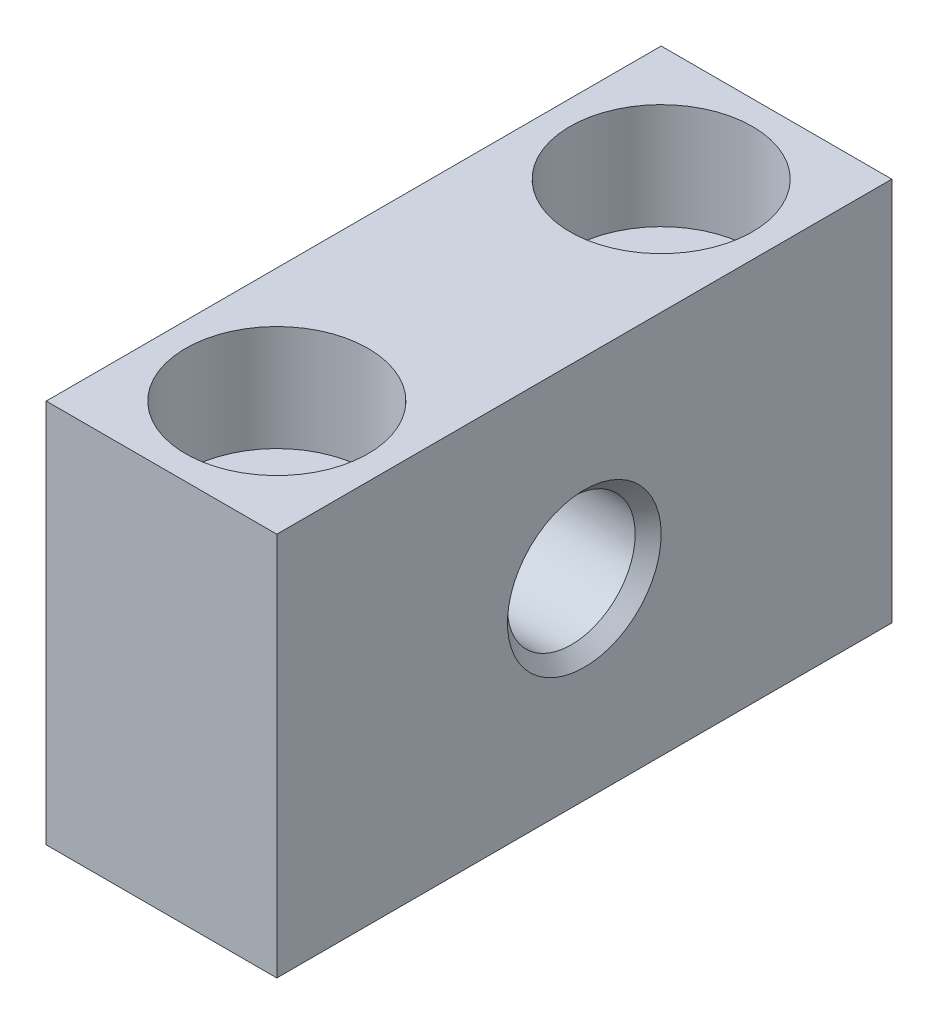
ISO-10303-21;
HEADER;
FILE_DESCRIPTION(('STEP AP214'),'2;1');
FILE_NAME('part.step','',(''),(''),'','','');
FILE_SCHEMA(('AUTOMOTIVE_DESIGN { 1 0 10303 214 1 1 1 1 }'));
ENDSEC;
DATA;
#1=APPLICATION_CONTEXT('core data for automotive mechanical design processes');
#2=APPLICATION_PROTOCOL_DEFINITION('international standard','automotive_design',2000,#1);
#3=PRODUCT_CONTEXT('',#1,'mechanical');
#4=PRODUCT('Part','Part','',(#3));
#5=PRODUCT_RELATED_PRODUCT_CATEGORY('part','',(#4));
#6=PRODUCT_DEFINITION_FORMATION('','',#4);
#7=PRODUCT_DEFINITION_CONTEXT('part definition',#1,'design');
#8=PRODUCT_DEFINITION('design','',#6,#7);
#9=PRODUCT_DEFINITION_SHAPE('','',#8);
#10=(LENGTH_UNIT() NAMED_UNIT(*) SI_UNIT(.MILLI.,.METRE.));
#11=(NAMED_UNIT(*) PLANE_ANGLE_UNIT() SI_UNIT($,.RADIAN.));
#12=(NAMED_UNIT(*) SI_UNIT($,.STERADIAN.) SOLID_ANGLE_UNIT());
#13=UNCERTAINTY_MEASURE_WITH_UNIT(LENGTH_MEASURE(1.E-05),#10,'distance_accuracy_value','');
#14=(GEOMETRIC_REPRESENTATION_CONTEXT(3) GLOBAL_UNCERTAINTY_ASSIGNED_CONTEXT((#13)) GLOBAL_UNIT_ASSIGNED_CONTEXT((#10,
#11,#12)) REPRESENTATION_CONTEXT('',''));
#15=CARTESIAN_POINT('',(0.,0.,0.));
#16=DIRECTION('',(0.,0.,1.));
#17=DIRECTION('',(1.,0.,0.));
#18=AXIS2_PLACEMENT_3D('',#15,#16,#17);
#19=CARTESIAN_POINT('',(6.,14.4999999999982,-10.));
#20=DIRECTION('',(0.,1.,0.));
#21=DIRECTION('',(-1.,0.,0.));
#22=AXIS2_PLACEMENT_3D('',#19,#20,#21);
#23=CONICAL_SURFACE('',#22,2.50000000012051,0.785398163397448);
#24=CARTESIAN_POINT('',(6.,14.4999999999413,-10.));
#25=DIRECTION('',(0.,1.,0.));
#26=DIRECTION('',(-1.,0.,0.));
#27=AXIS2_PLACEMENT_3D('',#24,#25,#26);
#28=CIRCLE('',#27,2.50000000006366);
#29=CARTESIAN_POINT('',(3.49999999993634,14.4999999999413,-10.));
#30=VERTEX_POINT('',#29);
#31=EDGE_CURVE('E106',#30,#30,#28,.F.);
#32=ORIENTED_EDGE('',*,*,#31,.F.);
#33=EDGE_LOOP('',(#32));
#34=FACE_BOUND('',#33,.T.);
#35=CARTESIAN_POINT('',(6.,14.067,-10.));
#36=DIRECTION('',(0.,1.,0.));
#37=DIRECTION('',(0.,0.,1.));
#38=AXIS2_PLACEMENT_3D('',#35,#36,#37);
#39=CIRCLE('',#38,2.067);
#40=CARTESIAN_POINT('',(6.,14.067,-7.933));
#41=VERTEX_POINT('',#40);
#42=EDGE_CURVE('E104',#41,#41,#39,.F.);
#43=ORIENTED_EDGE('',*,*,#42,.T.);
#44=EDGE_LOOP('',(#43));
#45=FACE_BOUND('',#44,.T.);
#46=ADVANCED_FACE('F17',(#34,#45),#23,.F.);
#47=CARTESIAN_POINT('',(6.,14.4999999999982,10.));
#48=DIRECTION('',(0.,1.,0.));
#49=DIRECTION('',(-1.,0.,0.));
#50=AXIS2_PLACEMENT_3D('',#47,#48,#49);
#51=CONICAL_SURFACE('',#50,2.50000000015916,0.785398163397448);
#52=CARTESIAN_POINT('',(6.,14.067,10.));
#53=DIRECTION('',(0.,1.,0.));
#54=DIRECTION('',(0.,0.,1.));
#55=AXIS2_PLACEMENT_3D('',#52,#53,#54);
#56=CIRCLE('',#55,2.067);
#57=CARTESIAN_POINT('',(6.,14.067,12.067));
#58=VERTEX_POINT('',#57);
#59=EDGE_CURVE('E100',#58,#58,#56,.F.);
#60=ORIENTED_EDGE('',*,*,#59,.T.);
#61=EDGE_LOOP('',(#60));
#62=FACE_BOUND('',#61,.T.);
#63=CARTESIAN_POINT('',(6.,14.4999999999413,10.));
#64=DIRECTION('',(0.,1.,0.));
#65=DIRECTION('',(-1.,0.,0.));
#66=AXIS2_PLACEMENT_3D('',#63,#64,#65);
#67=CIRCLE('',#66,2.50000000010232);
#68=CARTESIAN_POINT('',(3.49999999989768,14.4999999999413,10.));
#69=VERTEX_POINT('',#68);
#70=EDGE_CURVE('E20',#69,#69,#67,.F.);
#71=ORIENTED_EDGE('',*,*,#70,.F.);
#72=EDGE_LOOP('',(#71));
#73=FACE_BOUND('',#72,.T.);
#74=ADVANCED_FACE('F132',(#62,#73),#51,.F.);
#75=CARTESIAN_POINT('',(6.,14.5,10.));
#76=DIRECTION('',(0.,1.,0.));
#77=DIRECTION('',(0.,0.,1.));
#78=AXIS2_PLACEMENT_3D('',#75,#76,#77);
#79=PLANE('',#78);
#80=ORIENTED_EDGE('',*,*,#70,.T.);
#81=EDGE_LOOP('',(#80));
#82=FACE_BOUND('',#81,.T.);
#83=CARTESIAN_POINT('',(6.,14.5,10.));
#84=DIRECTION('',(0.,-1.,0.));
#85=DIRECTION('',(0.,0.,-1.));
#86=AXIS2_PLACEMENT_3D('',#83,#84,#85);
#87=CIRCLE('',#86,4.75);
#88=CARTESIAN_POINT('',(6.,14.5,5.25));
#89=VERTEX_POINT('',#88);
#90=EDGE_CURVE('E103',#89,#89,#87,.F.);
#91=ORIENTED_EDGE('',*,*,#90,.T.);
#92=EDGE_LOOP('',(#91));
#93=FACE_BOUND('',#92,.T.);
#94=ADVANCED_FACE('F129',(#82,#93),#79,.T.);
#95=CARTESIAN_POINT('',(6.,14.5,-10.));
#96=DIRECTION('',(0.,1.,0.));
#97=DIRECTION('',(0.,0.,1.));
#98=AXIS2_PLACEMENT_3D('',#95,#96,#97);
#99=PLANE('',#98);
#100=ORIENTED_EDGE('',*,*,#31,.T.);
#101=EDGE_LOOP('',(#100));
#102=FACE_BOUND('',#101,.T.);
#103=CARTESIAN_POINT('',(6.,14.5,-10.));
#104=DIRECTION('',(0.,-1.,0.));
#105=DIRECTION('',(0.,0.,-1.));
#106=AXIS2_PLACEMENT_3D('',#103,#104,#105);
#107=CIRCLE('',#106,4.75);
#108=CARTESIAN_POINT('',(6.,14.5,-14.75));
#109=VERTEX_POINT('',#108);
#110=EDGE_CURVE('E99',#109,#109,#107,.F.);
#111=ORIENTED_EDGE('',*,*,#110,.T.);
#112=EDGE_LOOP('',(#111));
#113=FACE_BOUND('',#112,.T.);
#114=ADVANCED_FACE('F140',(#102,#113),#99,.T.);
#115=CARTESIAN_POINT('',(6.,0.,-10.));
#116=DIRECTION('',(0.,1.,0.));
#117=DIRECTION('',(0.,0.,1.));
#118=AXIS2_PLACEMENT_3D('',#115,#116,#117);
#119=CYLINDRICAL_SURFACE('',#118,2.067);
#120=ORIENTED_EDGE('',*,*,#42,.F.);
#121=EDGE_LOOP('',(#120));
#122=FACE_BOUND('',#121,.T.);
#123=CARTESIAN_POINT('',(6.,0.433000000043648,-10.));
#124=DIRECTION('',(0.,-1.,0.));
#125=DIRECTION('',(0.,0.,-1.));
#126=AXIS2_PLACEMENT_3D('',#123,#124,#125);
#127=CIRCLE('',#126,2.06700000000183);
#128=CARTESIAN_POINT('',(6.,0.433000000043648,-12.0670000000018));
#129=VERTEX_POINT('',#128);
#130=EDGE_CURVE('E96',#129,#129,#127,.T.);
#131=ORIENTED_EDGE('',*,*,#130,.T.);
#132=EDGE_LOOP('',(#131));
#133=FACE_BOUND('',#132,.T.);
#134=ADVANCED_FACE('F198',(#122,#133),#119,.F.);
#135=CARTESIAN_POINT('',(6.,0.,10.));
#136=DIRECTION('',(0.,1.,0.));
#137=DIRECTION('',(0.,0.,1.));
#138=AXIS2_PLACEMENT_3D('',#135,#136,#137);
#139=CYLINDRICAL_SURFACE('',#138,2.067);
#140=ORIENTED_EDGE('',*,*,#59,.F.);
#141=EDGE_LOOP('',(#140));
#142=FACE_BOUND('',#141,.T.);
#143=CARTESIAN_POINT('',(6.,0.432999999986805,10.));
#144=DIRECTION('',(0.,-1.,0.));
#145=DIRECTION('',(0.,0.,-1.));
#146=AXIS2_PLACEMENT_3D('',#143,#144,#145);
#147=CIRCLE('',#146,2.06700000002002);
#148=CARTESIAN_POINT('',(6.,0.432999999986805,7.93299999997998));
#149=VERTEX_POINT('',#148);
#150=EDGE_CURVE('E93',#149,#149,#147,.T.);
#151=ORIENTED_EDGE('',*,*,#150,.T.);
#152=EDGE_LOOP('',(#151));
#153=FACE_BOUND('',#152,.T.);
#154=ADVANCED_FACE('F194',(#142,#153),#139,.F.);
#155=CARTESIAN_POINT('',(12.0000000000573,10.,0.));
#156=DIRECTION('',(1.,0.,0.));
#157=DIRECTION('',(0.,0.,-1.));
#158=AXIS2_PLACEMENT_3D('',#155,#156,#157);
#159=CONICAL_SURFACE('',#158,3.99999999996226,0.785398163397448);
#160=CARTESIAN_POINT('',(12.0000000000573,10.,0.));
#161=DIRECTION('',(1.,0.,0.));
#162=DIRECTION('',(0.,0.,-1.));
#163=AXIS2_PLACEMENT_3D('',#160,#161,#162);
#164=CIRCLE('',#163,3.99999999996226);
#165=CARTESIAN_POINT('',(12.0000000000573,10.,-3.99999999996226));
#166=VERTEX_POINT('',#165);
#167=EDGE_CURVE('E92',#166,#166,#164,.T.);
#168=ORIENTED_EDGE('',*,*,#167,.T.);
#169=EDGE_LOOP('',(#168));
#170=FACE_BOUND('',#169,.T.);
#171=CARTESIAN_POINT('',(11.3235,10.,0.));
#172=DIRECTION('',(-1.,0.,0.));
#173=DIRECTION('',(0.,0.,1.));
#174=AXIS2_PLACEMENT_3D('',#171,#172,#173);
#175=CIRCLE('',#174,3.3235);
#176=CARTESIAN_POINT('',(11.3235,10.,3.3235));
#177=VERTEX_POINT('',#176);
#178=EDGE_CURVE('E76',#177,#177,#175,.T.);
#179=ORIENTED_EDGE('',*,*,#178,.T.);
#180=EDGE_LOOP('',(#179));
#181=FACE_BOUND('',#180,.T.);
#182=ADVANCED_FACE('F190',(#170,#181),#159,.F.);
#183=CARTESIAN_POINT('',(6.,14.5,10.));
#184=DIRECTION('',(0.,-1.,0.));
#185=DIRECTION('',(0.,0.,-1.));
#186=AXIS2_PLACEMENT_3D('',#183,#184,#185);
#187=CYLINDRICAL_SURFACE('',#186,4.75);
#188=ORIENTED_EDGE('',*,*,#90,.F.);
#189=EDGE_LOOP('',(#188));
#190=FACE_BOUND('',#189,.T.);
#191=CARTESIAN_POINT('',(6.,20.,10.));
#192=DIRECTION('',(0.,-1.,0.));
#193=DIRECTION('',(0.,0.,-1.));
#194=AXIS2_PLACEMENT_3D('',#191,#192,#193);
#195=CIRCLE('',#194,4.75);
#196=CARTESIAN_POINT('',(6.,20.,5.25));
#197=VERTEX_POINT('',#196);
#198=EDGE_CURVE('E75',#197,#197,#195,.F.);
#199=ORIENTED_EDGE('',*,*,#198,.T.);
#200=EDGE_LOOP('',(#199));
#201=FACE_BOUND('',#200,.T.);
#202=ADVANCED_FACE('F186',(#190,#201),#187,.F.);
#203=CARTESIAN_POINT('',(6.,14.5,-10.));
#204=DIRECTION('',(0.,-1.,0.));
#205=DIRECTION('',(0.,0.,-1.));
#206=AXIS2_PLACEMENT_3D('',#203,#204,#205);
#207=CYLINDRICAL_SURFACE('',#206,4.75);
#208=ORIENTED_EDGE('',*,*,#110,.F.);
#209=EDGE_LOOP('',(#208));
#210=FACE_BOUND('',#209,.T.);
#211=CARTESIAN_POINT('',(6.,20.,-10.));
#212=DIRECTION('',(0.,-1.,0.));
#213=DIRECTION('',(0.,0.,-1.));
#214=AXIS2_PLACEMENT_3D('',#211,#212,#213);
#215=CIRCLE('',#214,4.75);
#216=CARTESIAN_POINT('',(6.,20.,-14.75));
#217=VERTEX_POINT('',#216);
#218=EDGE_CURVE('E66',#217,#217,#215,.F.);
#219=ORIENTED_EDGE('',*,*,#218,.T.);
#220=EDGE_LOOP('',(#219));
#221=FACE_BOUND('',#220,.T.);
#222=ADVANCED_FACE('F182',(#210,#221),#207,.F.);
#223=CARTESIAN_POINT('',(6.,0.,-10.));
#224=DIRECTION('',(0.,-1.,0.));
#225=DIRECTION('',(0.,0.,-1.));
#226=AXIS2_PLACEMENT_3D('',#223,#224,#225);
#227=CONICAL_SURFACE('',#226,2.50000000004547,0.785398163397448);
#228=ORIENTED_EDGE('',*,*,#130,.F.);
#229=EDGE_LOOP('',(#228));
#230=FACE_BOUND('',#229,.T.);
#231=CARTESIAN_POINT('',(6.,0.,-10.));
#232=DIRECTION('',(0.,-1.,0.));
#233=DIRECTION('',(0.,0.,-1.));
#234=AXIS2_PLACEMENT_3D('',#231,#232,#233);
#235=CIRCLE('',#234,2.50000000004547);
#236=CARTESIAN_POINT('',(6.,0.,-12.5000000000455));
#237=VERTEX_POINT('',#236);
#238=EDGE_CURVE('E111',#237,#237,#235,.T.);
#239=ORIENTED_EDGE('',*,*,#238,.T.);
#240=EDGE_LOOP('',(#239));
#241=FACE_BOUND('',#240,.T.);
#242=ADVANCED_FACE('F178',(#230,#241),#227,.F.);
#243=CARTESIAN_POINT('',(6.,5.6843418860808E-11,10.));
#244=DIRECTION('',(0.,-1.,0.));
#245=DIRECTION('',(0.,0.,-1.));
#246=AXIS2_PLACEMENT_3D('',#243,#244,#245);
#247=CONICAL_SURFACE('',#246,2.50000000000682,0.785398163463087);
#248=CARTESIAN_POINT('',(6.,6.59385740441604E-11,10.));
#249=DIRECTION('',(0.,-1.,0.));
#250=DIRECTION('',(0.,0.,-1.));
#251=AXIS2_PLACEMENT_3D('',#248,#249,#250);
#252=CIRCLE('',#251,2.49999999999773);
#253=CARTESIAN_POINT('',(6.,6.59385740441604E-11,7.50000000000227));
#254=VERTEX_POINT('',#253);
#255=EDGE_CURVE('E108',#254,#254,#252,.T.);
#256=ORIENTED_EDGE('',*,*,#255,.T.);
#257=EDGE_LOOP('',(#256));
#258=FACE_BOUND('',#257,.T.);
#259=ORIENTED_EDGE('',*,*,#150,.F.);
#260=EDGE_LOOP('',(#259));
#261=FACE_BOUND('',#260,.T.);
#262=ADVANCED_FACE('F174',(#258,#261),#247,.F.);
#263=CARTESIAN_POINT('',(12.,0.,16.));
#264=DIRECTION('',(-1.,0.,0.));
#265=DIRECTION('',(0.,0.,1.));
#266=AXIS2_PLACEMENT_3D('',#263,#264,#265);
#267=PLANE('',#266);
#268=ORIENTED_EDGE('',*,*,#167,.F.);
#269=EDGE_LOOP('',(#268));
#270=FACE_BOUND('',#269,.T.);
#271=DIRECTION('',(0.,0.,-1.));
#272=VECTOR('',#271,1.);
#273=CARTESIAN_POINT('',(12.,20.,16.));
#274=LINE('',#273,#272);
#275=CARTESIAN_POINT('',(12.,20.,-16.));
#276=VERTEX_POINT('',#275);
#277=CARTESIAN_POINT('',(12.,20.,16.));
#278=VERTEX_POINT('',#277);
#279=EDGE_CURVE('E69',#276,#278,#274,.F.);
#280=ORIENTED_EDGE('',*,*,#279,.T.);
#281=DIRECTION('',(0.,1.,0.));
#282=VECTOR('',#281,1.);
#283=CARTESIAN_POINT('',(12.,0.,16.));
#284=LINE('',#283,#282);
#285=CARTESIAN_POINT('',(12.,0.,16.));
#286=VERTEX_POINT('',#285);
#287=EDGE_CURVE('E56',#286,#278,#284,.T.);
#288=ORIENTED_EDGE('',*,*,#287,.F.);
#289=DIRECTION('',(0.,0.,1.));
#290=VECTOR('',#289,1.);
#291=CARTESIAN_POINT('',(12.,0.,16.));
#292=LINE('',#291,#290);
#293=CARTESIAN_POINT('',(12.,0.,-16.));
#294=VERTEX_POINT('',#293);
#295=EDGE_CURVE('E82',#286,#294,#292,.F.);
#296=ORIENTED_EDGE('',*,*,#295,.T.);
#297=DIRECTION('',(0.,1.,0.));
#298=VECTOR('',#297,1.);
#299=CARTESIAN_POINT('',(12.,0.,-16.));
#300=LINE('',#299,#298);
#301=EDGE_CURVE('E71',#294,#276,#300,.T.);
#302=ORIENTED_EDGE('',*,*,#301,.T.);
#303=EDGE_LOOP('',(#280,#288,#296,#302));
#304=FACE_BOUND('',#303,.T.);
#305=ADVANCED_FACE('F70',(#270,#304),#267,.F.);
#306=CARTESIAN_POINT('',(12.,10.,0.));
#307=DIRECTION('',(-1.,0.,0.));
#308=DIRECTION('',(0.,0.,1.));
#309=AXIS2_PLACEMENT_3D('',#306,#307,#308);
#310=CYLINDRICAL_SURFACE('',#309,3.3235);
#311=CARTESIAN_POINT('',(0.676499999940461,10.,0.));
#312=DIRECTION('',(-1.,0.,0.));
#313=DIRECTION('',(0.,0.,1.));
#314=AXIS2_PLACEMENT_3D('',#311,#312,#313);
#315=CIRCLE('',#314,3.3235000000218);
#316=CARTESIAN_POINT('',(0.676499999940461,10.,3.3235000000218));
#317=VERTEX_POINT('',#316);
#318=EDGE_CURVE('E86',#317,#317,#315,.T.);
#319=ORIENTED_EDGE('',*,*,#318,.T.);
#320=EDGE_LOOP('',(#319));
#321=FACE_BOUND('',#320,.T.);
#322=ORIENTED_EDGE('',*,*,#178,.F.);
#323=EDGE_LOOP('',(#322));
#324=FACE_BOUND('',#323,.T.);
#325=ADVANCED_FACE('F167',(#321,#324),#310,.F.);
#326=CARTESIAN_POINT('',(12.,20.,16.));
#327=DIRECTION('',(0.,-1.,0.));
#328=DIRECTION('',(0.,0.,-1.));
#329=AXIS2_PLACEMENT_3D('',#326,#327,#328);
#330=PLANE('',#329);
#331=ORIENTED_EDGE('',*,*,#218,.F.);
#332=EDGE_LOOP('',(#331));
#333=FACE_BOUND('',#332,.T.);
#334=ORIENTED_EDGE('',*,*,#198,.F.);
#335=EDGE_LOOP('',(#334));
#336=FACE_BOUND('',#335,.T.);
#337=DIRECTION('',(0.,0.,-1.));
#338=VECTOR('',#337,1.);
#339=CARTESIAN_POINT('',(0.,20.,16.));
#340=LINE('',#339,#338);
#341=CARTESIAN_POINT('',(0.,20.,-16.));
#342=VERTEX_POINT('',#341);
#343=CARTESIAN_POINT('',(0.,20.,16.));
#344=VERTEX_POINT('',#343);
#345=EDGE_CURVE('E80',#342,#344,#340,.F.);
#346=ORIENTED_EDGE('',*,*,#345,.T.);
#347=DIRECTION('',(1.,0.,0.));
#348=VECTOR('',#347,1.);
#349=CARTESIAN_POINT('',(0.,20.,16.));
#350=LINE('',#349,#348);
#351=EDGE_CURVE('E63',#278,#344,#350,.F.);
#352=ORIENTED_EDGE('',*,*,#351,.F.);
#353=ORIENTED_EDGE('',*,*,#279,.F.);
#354=DIRECTION('',(1.,0.,0.));
#355=VECTOR('',#354,1.);
#356=CARTESIAN_POINT('',(0.,20.,-16.));
#357=LINE('',#356,#355);
#358=EDGE_CURVE('E89',#276,#342,#357,.F.);
#359=ORIENTED_EDGE('',*,*,#358,.T.);
#360=EDGE_LOOP('',(#346,#352,#353,#359));
#361=FACE_BOUND('',#360,.T.);
#362=ADVANCED_FACE('F79',(#333,#336,#361),#330,.F.);
#363=CARTESIAN_POINT('',(0.,0.,16.));
#364=DIRECTION('',(0.,0.,1.));
#365=DIRECTION('',(1.,0.,0.));
#366=AXIS2_PLACEMENT_3D('',#363,#364,#365);
#367=PLANE('',#366);
#368=ORIENTED_EDGE('',*,*,#287,.T.);
#369=ORIENTED_EDGE('',*,*,#351,.T.);
#370=DIRECTION('',(0.,1.,0.));
#371=VECTOR('',#370,1.);
#372=CARTESIAN_POINT('',(0.,20.,16.));
#373=LINE('',#372,#371);
#374=CARTESIAN_POINT('',(0.,0.,16.));
#375=VERTEX_POINT('',#374);
#376=EDGE_CURVE('E342',#344,#375,#373,.F.);
#377=ORIENTED_EDGE('',*,*,#376,.T.);
#378=DIRECTION('',(1.,0.,0.));
#379=VECTOR('',#378,1.);
#380=CARTESIAN_POINT('',(0.,0.,16.));
#381=LINE('',#380,#379);
#382=EDGE_CURVE('E65',#375,#286,#381,.T.);
#383=ORIENTED_EDGE('',*,*,#382,.T.);
#384=EDGE_LOOP('',(#368,#369,#377,#383));
#385=FACE_BOUND('',#384,.T.);
#386=ADVANCED_FACE('F60',(#385),#367,.T.);
#387=CARTESIAN_POINT('',(0.,0.,16.));
#388=DIRECTION('',(0.,1.,0.));
#389=DIRECTION('',(0.,0.,1.));
#390=AXIS2_PLACEMENT_3D('',#387,#388,#389);
#391=PLANE('',#390);
#392=ORIENTED_EDGE('',*,*,#255,.F.);
#393=EDGE_LOOP('',(#392));
#394=FACE_BOUND('',#393,.T.);
#395=ORIENTED_EDGE('',*,*,#238,.F.);
#396=EDGE_LOOP('',(#395));
#397=FACE_BOUND('',#396,.T.);
#398=ORIENTED_EDGE('',*,*,#295,.F.);
#399=ORIENTED_EDGE('',*,*,#382,.F.);
#400=DIRECTION('',(0.,0.,-1.));
#401=VECTOR('',#400,1.);
#402=CARTESIAN_POINT('',(0.,0.,16.));
#403=LINE('',#402,#401);
#404=CARTESIAN_POINT('',(0.,0.,-16.));
#405=VERTEX_POINT('',#404);
#406=EDGE_CURVE('E344',#375,#405,#403,.T.);
#407=ORIENTED_EDGE('',*,*,#406,.T.);
#408=DIRECTION('',(1.,0.,0.));
#409=VECTOR('',#408,1.);
#410=CARTESIAN_POINT('',(0.,0.,-16.));
#411=LINE('',#410,#409);
#412=EDGE_CURVE('E35',#405,#294,#411,.T.);
#413=ORIENTED_EDGE('',*,*,#412,.T.);
#414=EDGE_LOOP('',(#398,#399,#407,#413));
#415=FACE_BOUND('',#414,.T.);
#416=ADVANCED_FACE('F159',(#394,#397,#415),#391,.F.);
#417=CARTESIAN_POINT('',(0.,0.,-16.));
#418=DIRECTION('',(0.,0.,1.));
#419=DIRECTION('',(1.,0.,0.));
#420=AXIS2_PLACEMENT_3D('',#417,#418,#419);
#421=PLANE('',#420);
#422=ORIENTED_EDGE('',*,*,#358,.F.);
#423=ORIENTED_EDGE('',*,*,#301,.F.);
#424=ORIENTED_EDGE('',*,*,#412,.F.);
#425=DIRECTION('',(0.,1.,0.));
#426=VECTOR('',#425,1.);
#427=CARTESIAN_POINT('',(0.,20.,-16.));
#428=LINE('',#427,#426);
#429=EDGE_CURVE('E26',#405,#342,#428,.T.);
#430=ORIENTED_EDGE('',*,*,#429,.T.);
#431=EDGE_LOOP('',(#422,#423,#424,#430));
#432=FACE_BOUND('',#431,.T.);
#433=ADVANCED_FACE('F151',(#432),#421,.F.);
#434=CARTESIAN_POINT('',(0.,10.,0.));
#435=DIRECTION('',(-1.,0.,0.));
#436=DIRECTION('',(0.,0.,1.));
#437=AXIS2_PLACEMENT_3D('',#434,#435,#436);
#438=CONICAL_SURFACE('',#437,3.99999999996226,0.785398163397448);
#439=ORIENTED_EDGE('',*,*,#318,.F.);
#440=EDGE_LOOP('',(#439));
#441=FACE_BOUND('',#440,.T.);
#442=CARTESIAN_POINT('',(0.,10.,0.));
#443=DIRECTION('',(-1.,0.,0.));
#444=DIRECTION('',(0.,0.,1.));
#445=AXIS2_PLACEMENT_3D('',#442,#443,#444);
#446=CIRCLE('',#445,3.99999999996226);
#447=CARTESIAN_POINT('',(0.,10.,3.99999999996226));
#448=VERTEX_POINT('',#447);
#449=EDGE_CURVE('E11',#448,#448,#446,.T.);
#450=ORIENTED_EDGE('',*,*,#449,.T.);
#451=EDGE_LOOP('',(#450));
#452=FACE_BOUND('',#451,.T.);
#453=ADVANCED_FACE('F145',(#441,#452),#438,.F.);
#454=CARTESIAN_POINT('',(0.,20.,16.));
#455=DIRECTION('',(1.,0.,0.));
#456=DIRECTION('',(0.,0.,-1.));
#457=AXIS2_PLACEMENT_3D('',#454,#455,#456);
#458=PLANE('',#457);
#459=ORIENTED_EDGE('',*,*,#449,.F.);
#460=EDGE_LOOP('',(#459));
#461=FACE_BOUND('',#460,.T.);
#462=ORIENTED_EDGE('',*,*,#406,.F.);
#463=ORIENTED_EDGE('',*,*,#376,.F.);
#464=ORIENTED_EDGE('',*,*,#345,.F.);
#465=ORIENTED_EDGE('',*,*,#429,.F.);
#466=EDGE_LOOP('',(#462,#463,#464,#465));
#467=FACE_BOUND('',#466,.T.);
#468=ADVANCED_FACE('F143',(#461,#467),#458,.F.);
#469=CLOSED_SHELL('',(#46,#74,#94,#114,#134,#154,#182,#202,#222,#242,#262,#305,#325,#362,#386,
#416,#433,#453,#468));
#470=MANIFOLD_SOLID_BREP('B1',#469);
#471=ADVANCED_BREP_SHAPE_REPRESENTATION('',(#18,#470),#14);
#472=SHAPE_DEFINITION_REPRESENTATION(#9,#471);
ENDSEC;
END-ISO-10303-21;
